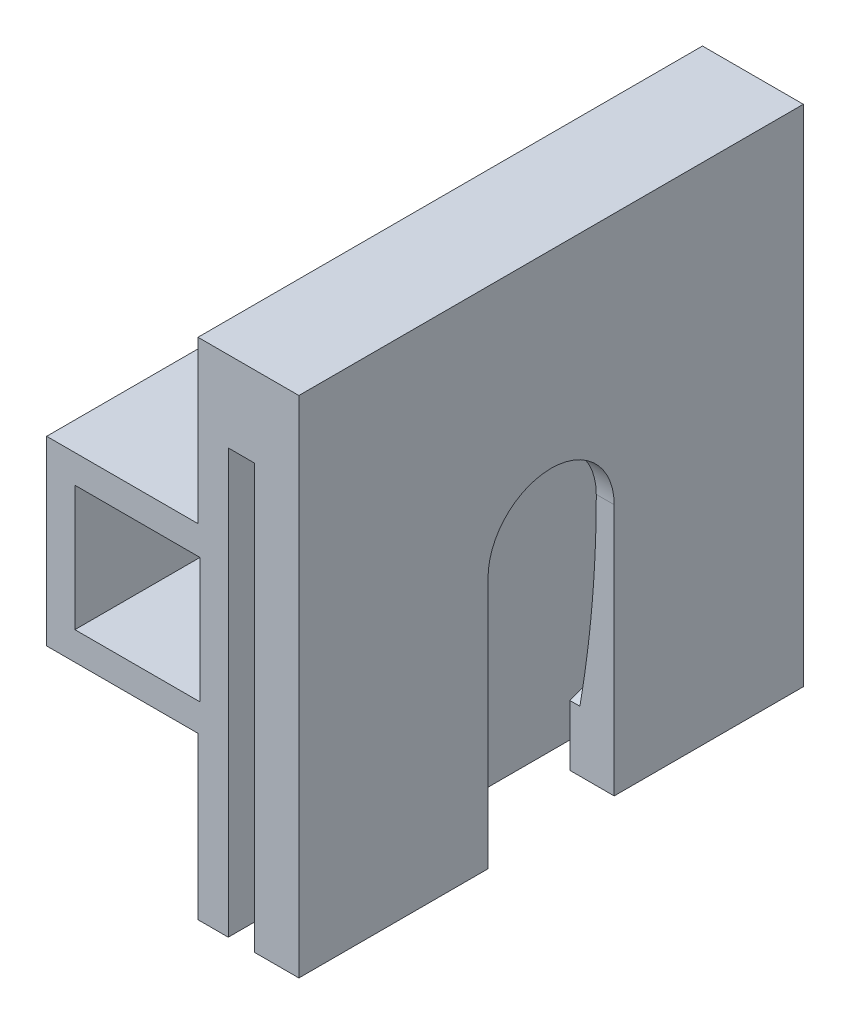
ISO-10303-21;
HEADER;
FILE_DESCRIPTION(('STEP AP214'),'2;1');
FILE_NAME('part.step','',(''),(''),'','','');
FILE_SCHEMA(('AUTOMOTIVE_DESIGN { 1 0 10303 214 1 1 1 1 }'));
ENDSEC;
DATA;
#1=APPLICATION_CONTEXT('core data for automotive mechanical design processes');
#2=APPLICATION_PROTOCOL_DEFINITION('international standard','automotive_design',2000,#1);
#3=PRODUCT_CONTEXT('',#1,'mechanical');
#4=PRODUCT('Part','Part','',(#3));
#5=PRODUCT_RELATED_PRODUCT_CATEGORY('part','',(#4));
#6=PRODUCT_DEFINITION_FORMATION('','',#4);
#7=PRODUCT_DEFINITION_CONTEXT('part definition',#1,'design');
#8=PRODUCT_DEFINITION('design','',#6,#7);
#9=PRODUCT_DEFINITION_SHAPE('','',#8);
#10=(LENGTH_UNIT() NAMED_UNIT(*) SI_UNIT(.MILLI.,.METRE.));
#11=(NAMED_UNIT(*) PLANE_ANGLE_UNIT() SI_UNIT($,.RADIAN.));
#12=(NAMED_UNIT(*) SI_UNIT($,.STERADIAN.) SOLID_ANGLE_UNIT());
#13=UNCERTAINTY_MEASURE_WITH_UNIT(LENGTH_MEASURE(1.E-05),#10,'distance_accuracy_value','');
#14=(GEOMETRIC_REPRESENTATION_CONTEXT(3) GLOBAL_UNCERTAINTY_ASSIGNED_CONTEXT((#13)) GLOBAL_UNIT_ASSIGNED_CONTEXT((#10,
#11,#12)) REPRESENTATION_CONTEXT('',''));
#15=CARTESIAN_POINT('',(0.,0.,0.));
#16=DIRECTION('',(0.,0.,1.));
#17=DIRECTION('',(1.,0.,0.));
#18=AXIS2_PLACEMENT_3D('',#15,#16,#17);
#19=CARTESIAN_POINT('',(-32.3553390593274,-12.5,25.));
#20=DIRECTION('',(0.,-1.,0.));
#21=DIRECTION('',(0.,0.,-1.));
#22=AXIS2_PLACEMENT_3D('',#19,#20,#21);
#23=PLANE('',#22);
#24=DIRECTION('',(1.,0.,0.));
#25=VECTOR('',#24,1.);
#26=CARTESIAN_POINT('',(-13.4642353760524,-12.5,9.375));
#27=LINE('',#26,#25);
#28=CARTESIAN_POINT('',(5.8,-12.5,9.375));
#29=VERTEX_POINT('',#28);
#30=CARTESIAN_POINT('',(8.,-12.5,9.375));
#31=VERTEX_POINT('',#30);
#32=EDGE_CURVE('E273',#29,#31,#27,.T.);
#33=ORIENTED_EDGE('',*,*,#32,.F.);
#34=DIRECTION('',(0.,0.,1.));
#35=VECTOR('',#34,1.);
#36=CARTESIAN_POINT('',(5.8,-12.5,0.));
#37=LINE('',#36,#35);
#38=CARTESIAN_POINT('',(5.8,-12.5,0.));
#39=VERTEX_POINT('',#38);
#40=EDGE_CURVE('E233',#39,#29,#37,.T.);
#41=ORIENTED_EDGE('',*,*,#40,.F.);
#42=DIRECTION('',(1.,0.,0.));
#43=VECTOR('',#42,1.);
#44=CARTESIAN_POINT('',(-32.3553390593274,-12.5,0.));
#45=LINE('',#44,#43);
#46=CARTESIAN_POINT('',(8.,-12.5,0.));
#47=VERTEX_POINT('',#46);
#48=EDGE_CURVE('E336',#39,#47,#45,.T.);
#49=ORIENTED_EDGE('',*,*,#48,.T.);
#50=DIRECTION('',(0.,0.,-1.));
#51=VECTOR('',#50,1.);
#52=CARTESIAN_POINT('',(8.,-12.5,25.));
#53=LINE('',#52,#51);
#54=EDGE_CURVE('E304',#31,#47,#53,.T.);
#55=ORIENTED_EDGE('',*,*,#54,.F.);
#56=EDGE_LOOP('',(#33,#41,#49,#55));
#57=FACE_BOUND('',#56,.T.);
#58=ADVANCED_FACE('F33',(#57),#23,.T.);
#59=DIRECTION('',(0.,0.,-1.));
#60=VECTOR('',#59,1.);
#61=CARTESIAN_POINT('',(4.5,-12.5,25.));
#62=LINE('',#61,#60);
#63=CARTESIAN_POINT('',(4.5,-12.5,25.));
#64=VERTEX_POINT('',#63);
#65=CARTESIAN_POINT('',(4.5,-12.5,0.));
#66=VERTEX_POINT('',#65);
#67=EDGE_CURVE('E272',#64,#66,#62,.T.);
#68=ORIENTED_EDGE('',*,*,#67,.F.);
#69=DIRECTION('',(1.,0.,0.));
#70=VECTOR('',#69,1.);
#71=CARTESIAN_POINT('',(-32.3553390593274,-12.5,25.));
#72=LINE('',#71,#70);
#73=CARTESIAN_POINT('',(3.,-12.5,25.));
#74=VERTEX_POINT('',#73);
#75=EDGE_CURVE('E337',#74,#64,#72,.T.);
#76=ORIENTED_EDGE('',*,*,#75,.F.);
#77=DIRECTION('',(0.,0.,1.));
#78=VECTOR('',#77,1.);
#79=CARTESIAN_POINT('',(3.,-12.5,25.));
#80=LINE('',#79,#78);
#81=CARTESIAN_POINT('',(3.,-12.5,0.));
#82=VERTEX_POINT('',#81);
#83=EDGE_CURVE('E328',#82,#74,#80,.T.);
#84=ORIENTED_EDGE('',*,*,#83,.F.);
#85=EDGE_CURVE('E333',#82,#66,#45,.T.);
#86=ORIENTED_EDGE('',*,*,#85,.T.);
#87=EDGE_LOOP('',(#68,#76,#84,#86));
#88=FACE_BOUND('',#87,.T.);
#89=ADVANCED_FACE('F456',(#88),#23,.T.);
#90=CARTESIAN_POINT('',(4.5,-4.5,25.));
#91=DIRECTION('',(0.,1.,0.));
#92=DIRECTION('',(0.,0.,1.));
#93=AXIS2_PLACEMENT_3D('',#90,#91,#92);
#94=PLANE('',#93);
#95=DIRECTION('',(0.,0.,-1.));
#96=VECTOR('',#95,1.);
#97=CARTESIAN_POINT('',(3.,-4.5,25.));
#98=LINE('',#97,#96);
#99=CARTESIAN_POINT('',(3.,-4.5,25.));
#100=VERTEX_POINT('',#99);
#101=CARTESIAN_POINT('',(3.,-4.5,0.));
#102=VERTEX_POINT('',#101);
#103=EDGE_CURVE('E344',#100,#102,#98,.T.);
#104=ORIENTED_EDGE('',*,*,#103,.F.);
#105=DIRECTION('',(1.,0.,0.));
#106=VECTOR('',#105,1.);
#107=CARTESIAN_POINT('',(4.5,-4.5,25.));
#108=LINE('',#107,#106);
#109=CARTESIAN_POINT('',(-4.5,-4.5,25.));
#110=VERTEX_POINT('',#109);
#111=EDGE_CURVE('E351',#110,#100,#108,.T.);
#112=ORIENTED_EDGE('',*,*,#111,.F.);
#113=DIRECTION('',(0.,0.,-1.));
#114=VECTOR('',#113,1.);
#115=CARTESIAN_POINT('',(-4.5,-4.5,25.));
#116=LINE('',#115,#114);
#117=CARTESIAN_POINT('',(-4.5,-4.5,0.));
#118=VERTEX_POINT('',#117);
#119=EDGE_CURVE('E365',#110,#118,#116,.T.);
#120=ORIENTED_EDGE('',*,*,#119,.T.);
#121=DIRECTION('',(1.,0.,0.));
#122=VECTOR('',#121,1.);
#123=CARTESIAN_POINT('',(4.5,-4.5,0.));
#124=LINE('',#123,#122);
#125=EDGE_CURVE('E360',#118,#102,#124,.T.);
#126=ORIENTED_EDGE('',*,*,#125,.T.);
#127=EDGE_LOOP('',(#104,#112,#120,#126));
#128=FACE_BOUND('',#127,.T.);
#129=ADVANCED_FACE('F458',(#128),#94,.F.);
#130=CARTESIAN_POINT('',(4.5,4.5,25.));
#131=DIRECTION('',(0.,-1.,0.));
#132=DIRECTION('',(1.,0.,0.));
#133=AXIS2_PLACEMENT_3D('',#130,#131,#132);
#134=PLANE('',#133);
#135=DIRECTION('',(0.,0.,1.));
#136=VECTOR('',#135,1.);
#137=CARTESIAN_POINT('',(3.,4.5,25.));
#138=LINE('',#137,#136);
#139=CARTESIAN_POINT('',(3.,4.5,0.));
#140=VERTEX_POINT('',#139);
#141=CARTESIAN_POINT('',(3.,4.5,25.));
#142=VERTEX_POINT('',#141);
#143=EDGE_CURVE('E341',#140,#142,#138,.T.);
#144=ORIENTED_EDGE('',*,*,#143,.F.);
#145=DIRECTION('',(-1.,0.,0.));
#146=VECTOR('',#145,1.);
#147=CARTESIAN_POINT('',(4.5,4.5,0.));
#148=LINE('',#147,#146);
#149=CARTESIAN_POINT('',(-4.5,4.5,0.));
#150=VERTEX_POINT('',#149);
#151=EDGE_CURVE('E352',#140,#150,#148,.T.);
#152=ORIENTED_EDGE('',*,*,#151,.T.);
#153=DIRECTION('',(0.,0.,-1.));
#154=VECTOR('',#153,1.);
#155=CARTESIAN_POINT('',(-4.5,4.5,25.));
#156=LINE('',#155,#154);
#157=CARTESIAN_POINT('',(-4.5,4.5,25.));
#158=VERTEX_POINT('',#157);
#159=EDGE_CURVE('E357',#158,#150,#156,.T.);
#160=ORIENTED_EDGE('',*,*,#159,.F.);
#161=DIRECTION('',(-1.,0.,0.));
#162=VECTOR('',#161,1.);
#163=CARTESIAN_POINT('',(4.5,4.5,25.));
#164=LINE('',#163,#162);
#165=EDGE_CURVE('E355',#142,#158,#164,.T.);
#166=ORIENTED_EDGE('',*,*,#165,.F.);
#167=EDGE_LOOP('',(#144,#152,#160,#166));
#168=FACE_BOUND('',#167,.T.);
#169=ADVANCED_FACE('F442',(#168),#134,.F.);
#170=CARTESIAN_POINT('',(-4.5,4.5,25.));
#171=DIRECTION('',(1.,0.,0.));
#172=DIRECTION('',(0.,0.,-1.));
#173=AXIS2_PLACEMENT_3D('',#170,#171,#172);
#174=PLANE('',#173);
#175=DIRECTION('',(0.,-1.,0.));
#176=VECTOR('',#175,1.);
#177=CARTESIAN_POINT('',(-4.5,4.5,0.));
#178=LINE('',#177,#176);
#179=EDGE_CURVE('E347',#150,#118,#178,.T.);
#180=ORIENTED_EDGE('',*,*,#179,.T.);
#181=ORIENTED_EDGE('',*,*,#119,.F.);
#182=DIRECTION('',(0.,-1.,0.));
#183=VECTOR('',#182,1.);
#184=CARTESIAN_POINT('',(-4.5,4.5,25.));
#185=LINE('',#184,#183);
#186=EDGE_CURVE('E348',#158,#110,#185,.T.);
#187=ORIENTED_EDGE('',*,*,#186,.F.);
#188=ORIENTED_EDGE('',*,*,#159,.T.);
#189=EDGE_LOOP('',(#180,#181,#187,#188));
#190=FACE_BOUND('',#189,.T.);
#191=ADVANCED_FACE('F35',(#190),#174,.F.);
#192=CARTESIAN_POINT('',(0.,0.,25.));
#193=DIRECTION('',(0.,0.,-1.));
#194=DIRECTION('',(-1.,0.,0.));
#195=AXIS2_PLACEMENT_3D('',#192,#193,#194);
#196=PLANE('',#195);
#197=DIRECTION('',(1.,0.,0.));
#198=VECTOR('',#197,1.);
#199=CARTESIAN_POINT('',(-3.1,3.1,25.));
#200=LINE('',#199,#198);
#201=CARTESIAN_POINT('',(-3.1,3.1,25.));
#202=VERTEX_POINT('',#201);
#203=CARTESIAN_POINT('',(3.1,3.1,25.));
#204=VERTEX_POINT('',#203);
#205=EDGE_CURVE('E202',#202,#204,#200,.T.);
#206=ORIENTED_EDGE('',*,*,#205,.T.);
#207=DIRECTION('',(0.,-1.,0.));
#208=VECTOR('',#207,1.);
#209=CARTESIAN_POINT('',(3.1,-3.1,25.));
#210=LINE('',#209,#208);
#211=CARTESIAN_POINT('',(3.1,-3.1,25.));
#212=VERTEX_POINT('',#211);
#213=EDGE_CURVE('E196',#204,#212,#210,.T.);
#214=ORIENTED_EDGE('',*,*,#213,.T.);
#215=DIRECTION('',(-1.,0.,0.));
#216=VECTOR('',#215,1.);
#217=CARTESIAN_POINT('',(-3.1,-3.1,25.));
#218=LINE('',#217,#216);
#219=CARTESIAN_POINT('',(-3.1,-3.1,25.));
#220=VERTEX_POINT('',#219);
#221=EDGE_CURVE('E205',#212,#220,#218,.T.);
#222=ORIENTED_EDGE('',*,*,#221,.T.);
#223=DIRECTION('',(0.,1.,0.));
#224=VECTOR('',#223,1.);
#225=CARTESIAN_POINT('',(-3.1,-3.1,25.));
#226=LINE('',#225,#224);
#227=EDGE_CURVE('E48',#220,#202,#226,.T.);
#228=ORIENTED_EDGE('',*,*,#227,.T.);
#229=EDGE_LOOP('',(#206,#214,#222,#228));
#230=FACE_BOUND('',#229,.T.);
#231=DIRECTION('',(0.,1.,0.));
#232=VECTOR('',#231,1.);
#233=CARTESIAN_POINT('',(5.8,-12.5,25.));
#234=LINE('',#233,#232);
#235=CARTESIAN_POINT('',(5.8,-12.5,25.));
#236=VERTEX_POINT('',#235);
#237=CARTESIAN_POINT('',(5.8,8.5,25.));
#238=VERTEX_POINT('',#237);
#239=EDGE_CURVE('E254',#236,#238,#234,.T.);
#240=ORIENTED_EDGE('',*,*,#239,.F.);
#241=CARTESIAN_POINT('',(8.,-12.5,25.));
#242=VERTEX_POINT('',#241);
#243=EDGE_CURVE('E317',#236,#242,#72,.T.);
#244=ORIENTED_EDGE('',*,*,#243,.T.);
#245=DIRECTION('',(0.,-1.,0.));
#246=VECTOR('',#245,1.);
#247=CARTESIAN_POINT('',(8.,12.5,25.));
#248=LINE('',#247,#246);
#249=CARTESIAN_POINT('',(8.,12.5,25.));
#250=VERTEX_POINT('',#249);
#251=EDGE_CURVE('E314',#250,#242,#248,.T.);
#252=ORIENTED_EDGE('',*,*,#251,.F.);
#253=DIRECTION('',(1.,0.,0.));
#254=VECTOR('',#253,1.);
#255=CARTESIAN_POINT('',(-32.3553390593274,12.5,25.));
#256=LINE('',#255,#254);
#257=CARTESIAN_POINT('',(3.,12.5,25.));
#258=VERTEX_POINT('',#257);
#259=EDGE_CURVE('E329',#258,#250,#256,.T.);
#260=ORIENTED_EDGE('',*,*,#259,.F.);
#261=DIRECTION('',(0.,1.,0.));
#262=VECTOR('',#261,1.);
#263=CARTESIAN_POINT('',(3.,12.5,25.));
#264=LINE('',#263,#262);
#265=EDGE_CURVE('E324',#142,#258,#264,.T.);
#266=ORIENTED_EDGE('',*,*,#265,.F.);
#267=ORIENTED_EDGE('',*,*,#165,.T.);
#268=ORIENTED_EDGE('',*,*,#186,.T.);
#269=ORIENTED_EDGE('',*,*,#111,.T.);
#270=EDGE_CURVE('E325',#74,#100,#264,.T.);
#271=ORIENTED_EDGE('',*,*,#270,.F.);
#272=ORIENTED_EDGE('',*,*,#75,.T.);
#273=DIRECTION('',(0.,-1.,0.));
#274=VECTOR('',#273,1.);
#275=CARTESIAN_POINT('',(4.5,8.5,25.));
#276=LINE('',#275,#274);
#277=CARTESIAN_POINT('',(4.5,8.5,25.));
#278=VERTEX_POINT('',#277);
#279=EDGE_CURVE('E290',#278,#64,#276,.T.);
#280=ORIENTED_EDGE('',*,*,#279,.F.);
#281=DIRECTION('',(-1.,0.,0.));
#282=VECTOR('',#281,1.);
#283=CARTESIAN_POINT('',(4.5,8.5,25.));
#284=LINE('',#283,#282);
#285=EDGE_CURVE('E286',#238,#278,#284,.T.);
#286=ORIENTED_EDGE('',*,*,#285,.F.);
#287=EDGE_LOOP('',(#240,#244,#252,#260,#266,#267,#268,#269,#271,#272,#280,#286));
#288=FACE_BOUND('',#287,.T.);
#289=ADVANCED_FACE('F209',(#230,#288),#196,.F.);
#290=CARTESIAN_POINT('',(0.,0.,0.));
#291=DIRECTION('',(0.,0.,-1.));
#292=DIRECTION('',(-1.,0.,0.));
#293=AXIS2_PLACEMENT_3D('',#290,#291,#292);
#294=PLANE('',#293);
#295=DIRECTION('',(0.,-1.,0.));
#296=VECTOR('',#295,1.);
#297=CARTESIAN_POINT('',(3.1,-3.1,0.));
#298=LINE('',#297,#296);
#299=CARTESIAN_POINT('',(3.1,3.1,0.));
#300=VERTEX_POINT('',#299);
#301=CARTESIAN_POINT('',(3.1,-3.1,0.));
#302=VERTEX_POINT('',#301);
#303=EDGE_CURVE('E56',#300,#302,#298,.T.);
#304=ORIENTED_EDGE('',*,*,#303,.F.);
#305=DIRECTION('',(1.,0.,0.));
#306=VECTOR('',#305,1.);
#307=CARTESIAN_POINT('',(-3.1,3.1,0.));
#308=LINE('',#307,#306);
#309=CARTESIAN_POINT('',(-3.1,3.1,0.));
#310=VERTEX_POINT('',#309);
#311=EDGE_CURVE('E212',#310,#300,#308,.T.);
#312=ORIENTED_EDGE('',*,*,#311,.F.);
#313=DIRECTION('',(0.,1.,0.));
#314=VECTOR('',#313,1.);
#315=CARTESIAN_POINT('',(-3.1,-3.1,0.));
#316=LINE('',#315,#314);
#317=CARTESIAN_POINT('',(-3.1,-3.1,0.));
#318=VERTEX_POINT('',#317);
#319=EDGE_CURVE('E215',#318,#310,#316,.T.);
#320=ORIENTED_EDGE('',*,*,#319,.F.);
#321=DIRECTION('',(-1.,0.,0.));
#322=VECTOR('',#321,1.);
#323=CARTESIAN_POINT('',(-3.1,-3.1,0.));
#324=LINE('',#323,#322);
#325=EDGE_CURVE('E221',#302,#318,#324,.T.);
#326=ORIENTED_EDGE('',*,*,#325,.F.);
#327=EDGE_LOOP('',(#304,#312,#320,#326));
#328=FACE_BOUND('',#327,.T.);
#329=ORIENTED_EDGE('',*,*,#48,.F.);
#330=DIRECTION('',(0.,-1.,0.));
#331=VECTOR('',#330,1.);
#332=CARTESIAN_POINT('',(5.8,8.5,0.));
#333=LINE('',#332,#331);
#334=CARTESIAN_POINT('',(5.8,8.5,0.));
#335=VERTEX_POINT('',#334);
#336=EDGE_CURVE('E227',#335,#39,#333,.T.);
#337=ORIENTED_EDGE('',*,*,#336,.F.);
#338=DIRECTION('',(1.,0.,0.));
#339=VECTOR('',#338,1.);
#340=CARTESIAN_POINT('',(4.5,8.5,0.));
#341=LINE('',#340,#339);
#342=CARTESIAN_POINT('',(4.5,8.5,0.));
#343=VERTEX_POINT('',#342);
#344=EDGE_CURVE('E282',#343,#335,#341,.T.);
#345=ORIENTED_EDGE('',*,*,#344,.F.);
#346=DIRECTION('',(0.,-1.,0.));
#347=VECTOR('',#346,1.);
#348=CARTESIAN_POINT('',(4.5,8.5,0.));
#349=LINE('',#348,#347);
#350=EDGE_CURVE('E288',#343,#66,#349,.T.);
#351=ORIENTED_EDGE('',*,*,#350,.T.);
#352=ORIENTED_EDGE('',*,*,#85,.F.);
#353=DIRECTION('',(0.,-1.,0.));
#354=VECTOR('',#353,1.);
#355=CARTESIAN_POINT('',(3.,12.5,0.));
#356=LINE('',#355,#354);
#357=EDGE_CURVE('E322',#102,#82,#356,.T.);
#358=ORIENTED_EDGE('',*,*,#357,.F.);
#359=ORIENTED_EDGE('',*,*,#125,.F.);
#360=ORIENTED_EDGE('',*,*,#179,.F.);
#361=ORIENTED_EDGE('',*,*,#151,.F.);
#362=CARTESIAN_POINT('',(3.,12.5,0.));
#363=VERTEX_POINT('',#362);
#364=EDGE_CURVE('E318',#363,#140,#356,.T.);
#365=ORIENTED_EDGE('',*,*,#364,.F.);
#366=DIRECTION('',(1.,0.,0.));
#367=VECTOR('',#366,1.);
#368=CARTESIAN_POINT('',(-32.3553390593274,12.5,0.));
#369=LINE('',#368,#367);
#370=CARTESIAN_POINT('',(8.,12.5,0.));
#371=VERTEX_POINT('',#370);
#372=EDGE_CURVE('E331',#363,#371,#369,.T.);
#373=ORIENTED_EDGE('',*,*,#372,.T.);
#374=DIRECTION('',(0.,1.,0.));
#375=VECTOR('',#374,1.);
#376=CARTESIAN_POINT('',(8.,-12.5,0.));
#377=LINE('',#376,#375);
#378=EDGE_CURVE('E308',#47,#371,#377,.T.);
#379=ORIENTED_EDGE('',*,*,#378,.F.);
#380=EDGE_LOOP('',(#329,#337,#345,#351,#352,#358,#359,#360,#361,#365,#373,#379));
#381=FACE_BOUND('',#380,.T.);
#382=ADVANCED_FACE('F429',(#328,#381),#294,.T.);
#383=CARTESIAN_POINT('',(-32.3553390593274,12.5,25.));
#384=DIRECTION('',(0.,1.,0.));
#385=DIRECTION('',(0.,0.,1.));
#386=AXIS2_PLACEMENT_3D('',#383,#384,#385);
#387=PLANE('',#386);
#388=DIRECTION('',(0.,0.,-1.));
#389=VECTOR('',#388,1.);
#390=CARTESIAN_POINT('',(3.,12.5,25.));
#391=LINE('',#390,#389);
#392=EDGE_CURVE('E321',#258,#363,#391,.T.);
#393=ORIENTED_EDGE('',*,*,#392,.F.);
#394=ORIENTED_EDGE('',*,*,#259,.T.);
#395=DIRECTION('',(0.,0.,1.));
#396=VECTOR('',#395,1.);
#397=CARTESIAN_POINT('',(8.,12.5,0.));
#398=LINE('',#397,#396);
#399=EDGE_CURVE('E311',#371,#250,#398,.T.);
#400=ORIENTED_EDGE('',*,*,#399,.F.);
#401=ORIENTED_EDGE('',*,*,#372,.F.);
#402=EDGE_LOOP('',(#393,#394,#400,#401));
#403=FACE_BOUND('',#402,.T.);
#404=ADVANCED_FACE('F435',(#403),#387,.T.);
#405=CARTESIAN_POINT('',(3.,3.,25.));
#406=DIRECTION('',(1.,0.,0.));
#407=DIRECTION('',(0.,1.,0.));
#408=AXIS2_PLACEMENT_3D('',#405,#406,#407);
#409=PLANE('',#408);
#410=ORIENTED_EDGE('',*,*,#364,.T.);
#411=ORIENTED_EDGE('',*,*,#143,.T.);
#412=ORIENTED_EDGE('',*,*,#265,.T.);
#413=ORIENTED_EDGE('',*,*,#392,.T.);
#414=EDGE_LOOP('',(#410,#411,#412,#413));
#415=FACE_BOUND('',#414,.T.);
#416=ADVANCED_FACE('F440',(#415),#409,.F.);
#417=ORIENTED_EDGE('',*,*,#270,.T.);
#418=ORIENTED_EDGE('',*,*,#103,.T.);
#419=ORIENTED_EDGE('',*,*,#357,.T.);
#420=ORIENTED_EDGE('',*,*,#83,.T.);
#421=EDGE_LOOP('',(#417,#418,#419,#420));
#422=FACE_BOUND('',#421,.T.);
#423=ADVANCED_FACE('F452',(#422),#409,.F.);
#424=DIRECTION('',(1.,0.,0.));
#425=VECTOR('',#424,1.);
#426=CARTESIAN_POINT('',(-13.4642353760524,-12.5,15.625));
#427=LINE('',#426,#425);
#428=CARTESIAN_POINT('',(5.8,-12.5,15.625));
#429=VERTEX_POINT('',#428);
#430=CARTESIAN_POINT('',(8.,-12.5,15.625));
#431=VERTEX_POINT('',#430);
#432=EDGE_CURVE('E275',#429,#431,#427,.T.);
#433=ORIENTED_EDGE('',*,*,#432,.T.);
#434=EDGE_CURVE('E305',#242,#431,#53,.T.);
#435=ORIENTED_EDGE('',*,*,#434,.F.);
#436=ORIENTED_EDGE('',*,*,#243,.F.);
#437=DIRECTION('',(0.,0.,1.));
#438=VECTOR('',#437,1.);
#439=CARTESIAN_POINT('',(5.8,-12.5,15.625));
#440=LINE('',#439,#438);
#441=EDGE_CURVE('E251',#429,#236,#440,.T.);
#442=ORIENTED_EDGE('',*,*,#441,.F.);
#443=EDGE_LOOP('',(#433,#435,#436,#442));
#444=FACE_BOUND('',#443,.T.);
#445=ADVANCED_FACE('F407',(#444),#23,.T.);
#446=CARTESIAN_POINT('',(8.,0.,0.));
#447=DIRECTION('',(1.,0.,0.));
#448=DIRECTION('',(0.,0.,-1.));
#449=AXIS2_PLACEMENT_3D('',#446,#447,#448);
#450=PLANE('',#449);
#451=DIRECTION('',(0.,1.,0.));
#452=VECTOR('',#451,1.);
#453=CARTESIAN_POINT('',(8.,0.,9.375));
#454=LINE('',#453,#452);
#455=CARTESIAN_POINT('',(8.,0.,9.375));
#456=VERTEX_POINT('',#455);
#457=EDGE_CURVE('E266',#31,#456,#454,.T.);
#458=ORIENTED_EDGE('',*,*,#457,.F.);
#459=ORIENTED_EDGE('',*,*,#54,.T.);
#460=ORIENTED_EDGE('',*,*,#378,.T.);
#461=ORIENTED_EDGE('',*,*,#399,.T.);
#462=ORIENTED_EDGE('',*,*,#251,.T.);
#463=ORIENTED_EDGE('',*,*,#434,.T.);
#464=DIRECTION('',(0.,-1.,0.));
#465=VECTOR('',#464,1.);
#466=CARTESIAN_POINT('',(8.,0.,15.625));
#467=LINE('',#466,#465);
#468=CARTESIAN_POINT('',(8.,0.,15.625));
#469=VERTEX_POINT('',#468);
#470=EDGE_CURVE('E264',#469,#431,#467,.T.);
#471=ORIENTED_EDGE('',*,*,#470,.F.);
#472=CARTESIAN_POINT('',(8.,0.,12.5));
#473=DIRECTION('',(1.,0.,0.));
#474=DIRECTION('',(0.,0.,-1.));
#475=AXIS2_PLACEMENT_3D('',#472,#473,#474);
#476=CIRCLE('',#475,3.125);
#477=EDGE_CURVE('E261',#456,#469,#476,.T.);
#478=ORIENTED_EDGE('',*,*,#477,.F.);
#479=EDGE_LOOP('',(#458,#459,#460,#461,#462,#463,#471,#478));
#480=FACE_BOUND('',#479,.T.);
#481=ADVANCED_FACE('F399',(#480),#450,.T.);
#482=CARTESIAN_POINT('',(0.,8.5,0.));
#483=DIRECTION('',(0.,-1.,0.));
#484=DIRECTION('',(0.,0.,-1.));
#485=AXIS2_PLACEMENT_3D('',#482,#483,#484);
#486=PLANE('',#485);
#487=DIRECTION('',(0.,0.,-1.));
#488=VECTOR('',#487,1.);
#489=CARTESIAN_POINT('',(5.8,8.5,7.23217312357364));
#490=LINE('',#489,#488);
#491=CARTESIAN_POINT('',(5.8,8.50000000000002,7.23217312357362));
#492=VERTEX_POINT('',#491);
#493=EDGE_CURVE('E240',#492,#335,#490,.T.);
#494=ORIENTED_EDGE('',*,*,#493,.F.);
#495=DIRECTION('',(1.,0.,0.));
#496=VECTOR('',#495,1.);
#497=CARTESIAN_POINT('',(4.575,8.5,7.23217312357362));
#498=LINE('',#497,#496);
#499=CARTESIAN_POINT('',(4.5,8.5,7.23217312357363));
#500=VERTEX_POINT('',#499);
#501=EDGE_CURVE('E296',#500,#492,#498,.T.);
#502=ORIENTED_EDGE('',*,*,#501,.F.);
#503=DIRECTION('',(0.,0.,-1.));
#504=VECTOR('',#503,1.);
#505=CARTESIAN_POINT('',(4.5,8.5,25.));
#506=LINE('',#505,#504);
#507=EDGE_CURVE('E283',#500,#343,#506,.T.);
#508=ORIENTED_EDGE('',*,*,#507,.T.);
#509=ORIENTED_EDGE('',*,*,#344,.T.);
#510=EDGE_LOOP('',(#494,#502,#508,#509));
#511=FACE_BOUND('',#510,.T.);
#512=ADVANCED_FACE('F426',(#511),#486,.T.);
#513=DIRECTION('',(0.,0.,-1.));
#514=VECTOR('',#513,1.);
#515=CARTESIAN_POINT('',(5.8,8.5,25.));
#516=LINE('',#515,#514);
#517=CARTESIAN_POINT('',(5.8,8.5,17.7678268764264));
#518=VERTEX_POINT('',#517);
#519=EDGE_CURVE('E256',#238,#518,#516,.T.);
#520=ORIENTED_EDGE('',*,*,#519,.F.);
#521=ORIENTED_EDGE('',*,*,#285,.T.);
#522=CARTESIAN_POINT('',(4.5,8.5,17.7678268764264));
#523=VERTEX_POINT('',#522);
#524=EDGE_CURVE('E279',#278,#523,#506,.T.);
#525=ORIENTED_EDGE('',*,*,#524,.T.);
#526=DIRECTION('',(1.,0.,0.));
#527=VECTOR('',#526,1.);
#528=CARTESIAN_POINT('',(4.575,8.5,17.7678268764264));
#529=LINE('',#528,#527);
#530=EDGE_CURVE('E292',#518,#523,#529,.F.);
#531=ORIENTED_EDGE('',*,*,#530,.F.);
#532=EDGE_LOOP('',(#520,#521,#525,#531));
#533=FACE_BOUND('',#532,.T.);
#534=ADVANCED_FACE('F417',(#533),#486,.T.);
#535=CARTESIAN_POINT('',(4.575,0.,12.5));
#536=DIRECTION('',(1.,0.,0.));
#537=DIRECTION('',(0.,0.,-1.));
#538=AXIS2_PLACEMENT_3D('',#535,#536,#537);
#539=CYLINDRICAL_SURFACE('',#538,10.);
#540=CARTESIAN_POINT('',(4.5,0.,12.5));
#541=DIRECTION('',(1.,0.,0.));
#542=DIRECTION('',(0.,0.,-1.));
#543=AXIS2_PLACEMENT_3D('',#540,#541,#542);
#544=CIRCLE('',#543,10.);
#545=EDGE_CURVE('E299',#500,#523,#544,.T.);
#546=ORIENTED_EDGE('',*,*,#545,.F.);
#547=ORIENTED_EDGE('',*,*,#501,.T.);
#548=CARTESIAN_POINT('',(5.8,0.,12.5));
#549=DIRECTION('',(1.,0.,0.));
#550=DIRECTION('',(0.,0.,1.));
#551=AXIS2_PLACEMENT_3D('',#548,#549,#550);
#552=CIRCLE('',#551,10.);
#553=CARTESIAN_POINT('',(5.8,-9.49917759598172,9.375));
#554=VERTEX_POINT('',#553);
#555=EDGE_CURVE('E238',#554,#492,#552,.T.);
#556=ORIENTED_EDGE('',*,*,#555,.F.);
#557=DIRECTION('',(1.,0.,0.));
#558=VECTOR('',#557,1.);
#559=CARTESIAN_POINT('',(5.8,-9.49917759598172,9.375));
#560=LINE('',#559,#558);
#561=CARTESIAN_POINT('',(6.3,-9.49917759598172,9.375));
#562=VERTEX_POINT('',#561);
#563=EDGE_CURVE('E242',#554,#562,#560,.T.);
#564=ORIENTED_EDGE('',*,*,#563,.T.);
#565=CARTESIAN_POINT('',(6.3,0.,12.5));
#566=DIRECTION('',(1.,0.,0.));
#567=DIRECTION('',(0.,0.,-1.));
#568=AXIS2_PLACEMENT_3D('',#565,#566,#567);
#569=CIRCLE('',#568,10.);
#570=CARTESIAN_POINT('',(6.3,-9.49917759598168,15.625));
#571=VERTEX_POINT('',#570);
#572=EDGE_CURVE('E302',#562,#571,#569,.T.);
#573=ORIENTED_EDGE('',*,*,#572,.T.);
#574=DIRECTION('',(1.,0.,0.));
#575=VECTOR('',#574,1.);
#576=CARTESIAN_POINT('',(5.8,-9.49917759598168,15.625));
#577=LINE('',#576,#575);
#578=CARTESIAN_POINT('',(5.8,-9.49917759598168,15.625));
#579=VERTEX_POINT('',#578);
#580=EDGE_CURVE('E258',#579,#571,#577,.T.);
#581=ORIENTED_EDGE('',*,*,#580,.F.);
#582=CARTESIAN_POINT('',(5.8,0.,12.5));
#583=DIRECTION('',(1.,0.,0.));
#584=DIRECTION('',(0.,0.,1.));
#585=AXIS2_PLACEMENT_3D('',#582,#583,#584);
#586=CIRCLE('',#585,10.);
#587=EDGE_CURVE('E245',#518,#579,#586,.T.);
#588=ORIENTED_EDGE('',*,*,#587,.F.);
#589=ORIENTED_EDGE('',*,*,#530,.T.);
#590=EDGE_LOOP('',(#546,#547,#556,#564,#573,#581,#588,#589));
#591=FACE_BOUND('',#590,.T.);
#592=ADVANCED_FACE('F387',(#591),#539,.F.);
#593=CARTESIAN_POINT('',(-48.81,0.,12.5));
#594=DIRECTION('',(1.,0.,0.));
#595=DIRECTION('',(0.,1.,0.));
#596=AXIS2_PLACEMENT_3D('',#593,#594,#595);
#597=SPHERICAL_SURFACE('',#596,56.0099285841359);
#598=CARTESIAN_POINT('',(-48.81,0.,9.375));
#599=DIRECTION('',(0.,0.,-1.));
#600=DIRECTION('',(0.,1.,0.));
#601=AXIS2_PLACEMENT_3D('',#598,#599,#600);
#602=CIRCLE('',#601,55.9226830096697);
#603=CARTESIAN_POINT('',(7.1126830096697,0.,9.375));
#604=VERTEX_POINT('',#603);
#605=EDGE_CURVE('E11',#604,#562,#602,.T.);
#606=ORIENTED_EDGE('',*,*,#605,.F.);
#607=CARTESIAN_POINT('',(7.1126830096697,0.,12.5));
#608=DIRECTION('',(-1.,0.,0.));
#609=DIRECTION('',(0.,0.,1.));
#610=AXIS2_PLACEMENT_3D('',#607,#608,#609);
#611=CIRCLE('',#610,3.125);
#612=CARTESIAN_POINT('',(7.1126830096697,0.,15.625));
#613=VERTEX_POINT('',#612);
#614=EDGE_CURVE('E41',#613,#604,#611,.T.);
#615=ORIENTED_EDGE('',*,*,#614,.F.);
#616=CARTESIAN_POINT('',(-48.81,0.,15.625));
#617=DIRECTION('',(0.,0.,1.));
#618=DIRECTION('',(0.,-1.,0.));
#619=AXIS2_PLACEMENT_3D('',#616,#617,#618);
#620=CIRCLE('',#619,55.9226830096697);
#621=EDGE_CURVE('E368',#571,#613,#620,.T.);
#622=ORIENTED_EDGE('',*,*,#621,.F.);
#623=ORIENTED_EDGE('',*,*,#572,.F.);
#624=EDGE_LOOP('',(#606,#615,#622,#623));
#625=FACE_BOUND('',#624,.T.);
#626=ADVANCED_FACE('F382',(#625),#597,.F.);
#627=CARTESIAN_POINT('',(4.5,10.,12.5));
#628=DIRECTION('',(1.,0.,0.));
#629=DIRECTION('',(0.,0.,-1.));
#630=AXIS2_PLACEMENT_3D('',#627,#628,#629);
#631=PLANE('',#630);
#632=ORIENTED_EDGE('',*,*,#545,.T.);
#633=ORIENTED_EDGE('',*,*,#524,.F.);
#634=ORIENTED_EDGE('',*,*,#279,.T.);
#635=ORIENTED_EDGE('',*,*,#67,.T.);
#636=ORIENTED_EDGE('',*,*,#350,.F.);
#637=ORIENTED_EDGE('',*,*,#507,.F.);
#638=EDGE_LOOP('',(#632,#633,#634,#635,#636,#637));
#639=FACE_BOUND('',#638,.T.);
#640=ADVANCED_FACE('F420',(#639),#631,.T.);
#641=CARTESIAN_POINT('',(-13.4642353760524,0.,12.5));
#642=DIRECTION('',(1.,0.,0.));
#643=DIRECTION('',(0.,0.,-1.));
#644=AXIS2_PLACEMENT_3D('',#641,#642,#643);
#645=CYLINDRICAL_SURFACE('',#644,3.125);
#646=ORIENTED_EDGE('',*,*,#614,.T.);
#647=DIRECTION('',(1.,0.,0.));
#648=VECTOR('',#647,1.);
#649=CARTESIAN_POINT('',(-13.4642353760524,0.,9.375));
#650=LINE('',#649,#648);
#651=EDGE_CURVE('E270',#604,#456,#650,.T.);
#652=ORIENTED_EDGE('',*,*,#651,.T.);
#653=ORIENTED_EDGE('',*,*,#477,.T.);
#654=DIRECTION('',(1.,0.,0.));
#655=VECTOR('',#654,1.);
#656=CARTESIAN_POINT('',(-13.4642353760524,0.,15.625));
#657=LINE('',#656,#655);
#658=EDGE_CURVE('E269',#613,#469,#657,.T.);
#659=ORIENTED_EDGE('',*,*,#658,.F.);
#660=EDGE_LOOP('',(#646,#652,#653,#659));
#661=FACE_BOUND('',#660,.T.);
#662=ADVANCED_FACE('F373',(#661),#645,.F.);
#663=CARTESIAN_POINT('',(-13.4642353760524,0.,9.375));
#664=DIRECTION('',(0.,0.,-1.));
#665=DIRECTION('',(0.,1.,0.));
#666=AXIS2_PLACEMENT_3D('',#663,#664,#665);
#667=PLANE('',#666);
#668=ORIENTED_EDGE('',*,*,#605,.T.);
#669=ORIENTED_EDGE('',*,*,#563,.F.);
#670=DIRECTION('',(0.,1.,0.));
#671=VECTOR('',#670,1.);
#672=CARTESIAN_POINT('',(5.8,-12.5,9.375));
#673=LINE('',#672,#671);
#674=EDGE_CURVE('E236',#29,#554,#673,.T.);
#675=ORIENTED_EDGE('',*,*,#674,.F.);
#676=ORIENTED_EDGE('',*,*,#32,.T.);
#677=ORIENTED_EDGE('',*,*,#457,.T.);
#678=ORIENTED_EDGE('',*,*,#651,.F.);
#679=EDGE_LOOP('',(#668,#669,#675,#676,#677,#678));
#680=FACE_BOUND('',#679,.T.);
#681=ADVANCED_FACE('F378',(#680),#667,.F.);
#682=CARTESIAN_POINT('',(-13.4642353760524,0.,15.625));
#683=DIRECTION('',(0.,0.,1.));
#684=DIRECTION('',(0.,-1.,0.));
#685=AXIS2_PLACEMENT_3D('',#682,#683,#684);
#686=PLANE('',#685);
#687=ORIENTED_EDGE('',*,*,#621,.T.);
#688=ORIENTED_EDGE('',*,*,#658,.T.);
#689=ORIENTED_EDGE('',*,*,#470,.T.);
#690=ORIENTED_EDGE('',*,*,#432,.F.);
#691=DIRECTION('',(0.,-1.,0.));
#692=VECTOR('',#691,1.);
#693=CARTESIAN_POINT('',(5.8,-9.49917759598168,15.625));
#694=LINE('',#693,#692);
#695=EDGE_CURVE('E248',#579,#429,#694,.T.);
#696=ORIENTED_EDGE('',*,*,#695,.F.);
#697=ORIENTED_EDGE('',*,*,#580,.T.);
#698=EDGE_LOOP('',(#687,#688,#689,#690,#696,#697));
#699=FACE_BOUND('',#698,.T.);
#700=ADVANCED_FACE('F404',(#699),#686,.F.);
#701=CARTESIAN_POINT('',(5.8,0.,12.5));
#702=DIRECTION('',(-1.,0.,0.));
#703=DIRECTION('',(0.,0.,1.));
#704=AXIS2_PLACEMENT_3D('',#701,#702,#703);
#705=PLANE('',#704);
#706=ORIENTED_EDGE('',*,*,#587,.T.);
#707=ORIENTED_EDGE('',*,*,#695,.T.);
#708=ORIENTED_EDGE('',*,*,#441,.T.);
#709=ORIENTED_EDGE('',*,*,#239,.T.);
#710=ORIENTED_EDGE('',*,*,#519,.T.);
#711=EDGE_LOOP('',(#706,#707,#708,#709,#710));
#712=FACE_BOUND('',#711,.T.);
#713=ADVANCED_FACE('F410',(#712),#705,.T.);
#714=CARTESIAN_POINT('',(5.8,0.,12.5));
#715=DIRECTION('',(-1.,0.,0.));
#716=DIRECTION('',(0.,0.,1.));
#717=AXIS2_PLACEMENT_3D('',#714,#715,#716);
#718=PLANE('',#717);
#719=ORIENTED_EDGE('',*,*,#336,.T.);
#720=ORIENTED_EDGE('',*,*,#40,.T.);
#721=ORIENTED_EDGE('',*,*,#674,.T.);
#722=ORIENTED_EDGE('',*,*,#555,.T.);
#723=ORIENTED_EDGE('',*,*,#493,.T.);
#724=EDGE_LOOP('',(#719,#720,#721,#722,#723));
#725=FACE_BOUND('',#724,.T.);
#726=ADVANCED_FACE('F390',(#725),#718,.T.);
#727=CARTESIAN_POINT('',(3.1,-3.1,25.));
#728=DIRECTION('',(1.,0.,0.));
#729=DIRECTION('',(0.,0.,-1.));
#730=AXIS2_PLACEMENT_3D('',#727,#728,#729);
#731=PLANE('',#730);
#732=ORIENTED_EDGE('',*,*,#303,.T.);
#733=DIRECTION('',(0.,0.,-1.));
#734=VECTOR('',#733,1.);
#735=CARTESIAN_POINT('',(3.1,-3.1,25.));
#736=LINE('',#735,#734);
#737=EDGE_CURVE('E192',#212,#302,#736,.T.);
#738=ORIENTED_EDGE('',*,*,#737,.F.);
#739=ORIENTED_EDGE('',*,*,#213,.F.);
#740=DIRECTION('',(0.,0.,-1.));
#741=VECTOR('',#740,1.);
#742=CARTESIAN_POINT('',(3.1,3.1,25.));
#743=LINE('',#742,#741);
#744=EDGE_CURVE('E225',#204,#300,#743,.T.);
#745=ORIENTED_EDGE('',*,*,#744,.T.);
#746=EDGE_LOOP('',(#732,#738,#739,#745));
#747=FACE_BOUND('',#746,.T.);
#748=ADVANCED_FACE('F194',(#747),#731,.F.);
#749=CARTESIAN_POINT('',(-3.1,3.1,25.));
#750=DIRECTION('',(0.,1.,0.));
#751=DIRECTION('',(0.,0.,1.));
#752=AXIS2_PLACEMENT_3D('',#749,#750,#751);
#753=PLANE('',#752);
#754=ORIENTED_EDGE('',*,*,#311,.T.);
#755=ORIENTED_EDGE('',*,*,#744,.F.);
#756=ORIENTED_EDGE('',*,*,#205,.F.);
#757=DIRECTION('',(0.,0.,-1.));
#758=VECTOR('',#757,1.);
#759=CARTESIAN_POINT('',(-3.1,3.1,25.));
#760=LINE('',#759,#758);
#761=EDGE_CURVE('E228',#202,#310,#760,.T.);
#762=ORIENTED_EDGE('',*,*,#761,.T.);
#763=EDGE_LOOP('',(#754,#755,#756,#762));
#764=FACE_BOUND('',#763,.T.);
#765=ADVANCED_FACE('F520',(#764),#753,.F.);
#766=CARTESIAN_POINT('',(-3.1,-3.1,25.));
#767=DIRECTION('',(-1.,0.,0.));
#768=DIRECTION('',(0.,0.,1.));
#769=AXIS2_PLACEMENT_3D('',#766,#767,#768);
#770=PLANE('',#769);
#771=ORIENTED_EDGE('',*,*,#319,.T.);
#772=ORIENTED_EDGE('',*,*,#761,.F.);
#773=ORIENTED_EDGE('',*,*,#227,.F.);
#774=DIRECTION('',(0.,0.,-1.));
#775=VECTOR('',#774,1.);
#776=CARTESIAN_POINT('',(-3.1,-3.1,25.));
#777=LINE('',#776,#775);
#778=EDGE_CURVE('E201',#220,#318,#777,.T.);
#779=ORIENTED_EDGE('',*,*,#778,.T.);
#780=EDGE_LOOP('',(#771,#772,#773,#779));
#781=FACE_BOUND('',#780,.T.);
#782=ADVANCED_FACE('F529',(#781),#770,.F.);
#783=CARTESIAN_POINT('',(-3.1,-3.1,25.));
#784=DIRECTION('',(0.,-1.,0.));
#785=DIRECTION('',(0.,0.,-1.));
#786=AXIS2_PLACEMENT_3D('',#783,#784,#785);
#787=PLANE('',#786);
#788=ORIENTED_EDGE('',*,*,#325,.T.);
#789=ORIENTED_EDGE('',*,*,#778,.F.);
#790=ORIENTED_EDGE('',*,*,#221,.F.);
#791=ORIENTED_EDGE('',*,*,#737,.T.);
#792=EDGE_LOOP('',(#788,#789,#790,#791));
#793=FACE_BOUND('',#792,.T.);
#794=ADVANCED_FACE('F206',(#793),#787,.F.);
#795=CLOSED_SHELL('',(#58,#89,#129,#169,#191,#289,#382,#404,#416,#423,#445,#481,#512,#534,#592,
#626,#640,#662,#681,#700,#713,#726,#748,#765,#782,#794));
#796=MANIFOLD_SOLID_BREP('B2',#795);
#797=ADVANCED_BREP_SHAPE_REPRESENTATION('',(#18,#796),#14);
#798=SHAPE_DEFINITION_REPRESENTATION(#9,#797);
ENDSEC;
END-ISO-10303-21;
